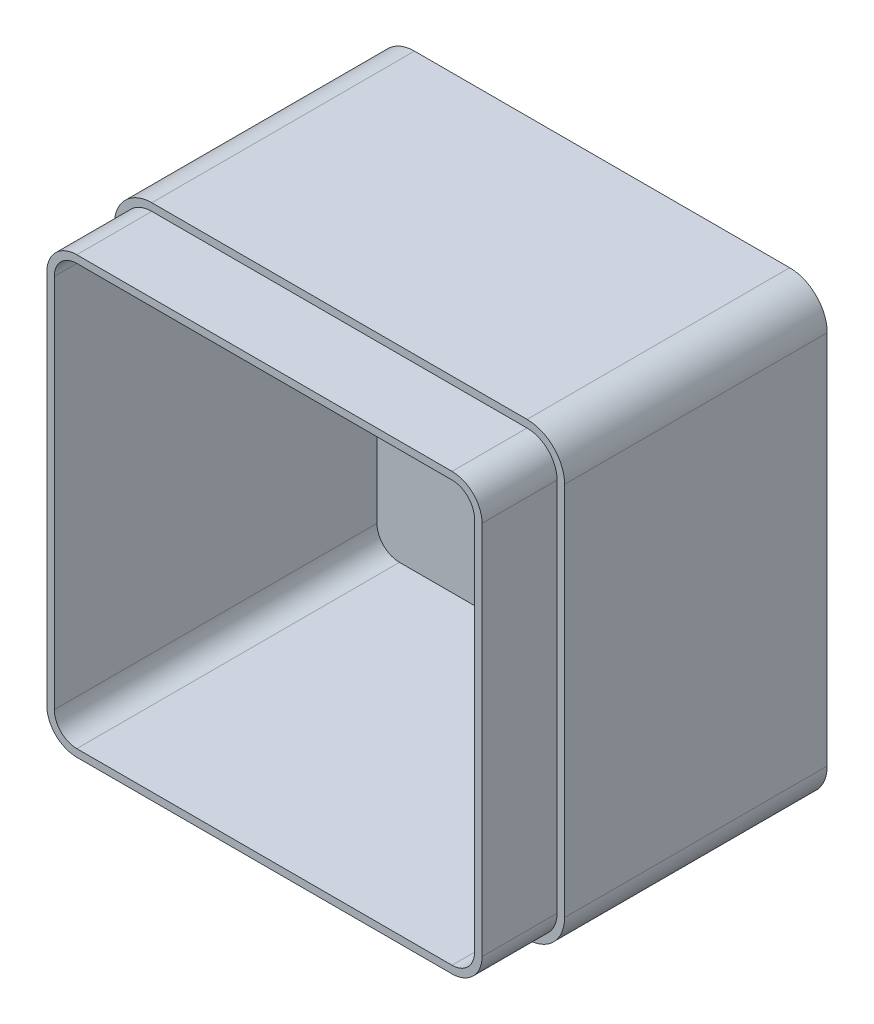
ISO-10303-21;
HEADER;
FILE_DESCRIPTION(('STEP AP214'),'2;1');
FILE_NAME('part.step','',(''),(''),'','','');
FILE_SCHEMA(('AUTOMOTIVE_DESIGN { 1 0 10303 214 1 1 1 1 }'));
ENDSEC;
DATA;
#1=APPLICATION_CONTEXT('core data for automotive mechanical design processes');
#2=APPLICATION_PROTOCOL_DEFINITION('international standard','automotive_design',2000,#1);
#3=PRODUCT_CONTEXT('',#1,'mechanical');
#4=PRODUCT('Part','Part','',(#3));
#5=PRODUCT_RELATED_PRODUCT_CATEGORY('part','',(#4));
#6=PRODUCT_DEFINITION_FORMATION('','',#4);
#7=PRODUCT_DEFINITION_CONTEXT('part definition',#1,'design');
#8=PRODUCT_DEFINITION('design','',#6,#7);
#9=PRODUCT_DEFINITION_SHAPE('','',#8);
#10=(LENGTH_UNIT() NAMED_UNIT(*) SI_UNIT(.MILLI.,.METRE.));
#11=(NAMED_UNIT(*) PLANE_ANGLE_UNIT() SI_UNIT($,.RADIAN.));
#12=(NAMED_UNIT(*) SI_UNIT($,.STERADIAN.) SOLID_ANGLE_UNIT());
#13=UNCERTAINTY_MEASURE_WITH_UNIT(LENGTH_MEASURE(1.E-05),#10,'distance_accuracy_value','');
#14=(GEOMETRIC_REPRESENTATION_CONTEXT(3) GLOBAL_UNCERTAINTY_ASSIGNED_CONTEXT((#13)) GLOBAL_UNIT_ASSIGNED_CONTEXT((#10,
#11,#12)) REPRESENTATION_CONTEXT('',''));
#15=CARTESIAN_POINT('',(0.,0.,0.));
#16=DIRECTION('',(0.,0.,1.));
#17=DIRECTION('',(1.,0.,0.));
#18=AXIS2_PLACEMENT_3D('',#15,#16,#17);
#19=CARTESIAN_POINT('',(0.,0.,90.));
#20=DIRECTION('',(0.,0.,-1.));
#21=DIRECTION('',(-1.,0.,0.));
#22=AXIS2_PLACEMENT_3D('',#19,#20,#21);
#23=PLANE('',#22);
#24=DIRECTION('',(0.,-1.,0.));
#25=VECTOR('',#24,1.);
#26=CARTESIAN_POINT('',(4.,0.,90.));
#27=LINE('',#26,#25);
#28=CARTESIAN_POINT('',(4.,110.,90.));
#29=VERTEX_POINT('',#28);
#30=CARTESIAN_POINT('',(4.,9.99999999999999,90.));
#31=VERTEX_POINT('',#30);
#32=EDGE_CURVE('E349',#29,#31,#27,.T.);
#33=ORIENTED_EDGE('',*,*,#32,.F.);
#34=CARTESIAN_POINT('',(10.,110.,90.));
#35=DIRECTION('',(0.,0.,-1.));
#36=DIRECTION('',(-1.,0.,0.));
#37=AXIS2_PLACEMENT_3D('',#34,#35,#36);
#38=CIRCLE('',#37,6.);
#39=CARTESIAN_POINT('',(9.99999999999999,116.,90.));
#40=VERTEX_POINT('',#39);
#41=EDGE_CURVE('E395',#40,#29,#38,.F.);
#42=ORIENTED_EDGE('',*,*,#41,.F.);
#43=DIRECTION('',(-1.,0.,0.));
#44=VECTOR('',#43,1.);
#45=CARTESIAN_POINT('',(0.,116.,90.));
#46=LINE('',#45,#44);
#47=CARTESIAN_POINT('',(110.,116.,90.));
#48=VERTEX_POINT('',#47);
#49=EDGE_CURVE('E364',#48,#40,#46,.T.);
#50=ORIENTED_EDGE('',*,*,#49,.F.);
#51=CARTESIAN_POINT('',(110.,110.,90.));
#52=DIRECTION('',(0.,0.,-1.));
#53=DIRECTION('',(-1.,0.,0.));
#54=AXIS2_PLACEMENT_3D('',#51,#52,#53);
#55=CIRCLE('',#54,6.);
#56=CARTESIAN_POINT('',(116.,110.,90.));
#57=VERTEX_POINT('',#56);
#58=EDGE_CURVE('E328',#57,#48,#55,.F.);
#59=ORIENTED_EDGE('',*,*,#58,.F.);
#60=DIRECTION('',(0.,1.,0.));
#61=VECTOR('',#60,1.);
#62=CARTESIAN_POINT('',(116.,0.,90.));
#63=LINE('',#62,#61);
#64=CARTESIAN_POINT('',(116.,9.99999999999999,90.));
#65=VERTEX_POINT('',#64);
#66=EDGE_CURVE('E392',#65,#57,#63,.T.);
#67=ORIENTED_EDGE('',*,*,#66,.F.);
#68=CARTESIAN_POINT('',(110.,10.,90.));
#69=DIRECTION('',(0.,0.,-1.));
#70=DIRECTION('',(-1.,0.,0.));
#71=AXIS2_PLACEMENT_3D('',#68,#69,#70);
#72=CIRCLE('',#71,6.);
#73=CARTESIAN_POINT('',(110.,4.,90.));
#74=VERTEX_POINT('',#73);
#75=EDGE_CURVE('E388',#74,#65,#72,.F.);
#76=ORIENTED_EDGE('',*,*,#75,.F.);
#77=DIRECTION('',(1.,0.,0.));
#78=VECTOR('',#77,1.);
#79=CARTESIAN_POINT('',(0.,4.,90.));
#80=LINE('',#79,#78);
#81=CARTESIAN_POINT('',(9.99999999999999,4.,90.));
#82=VERTEX_POINT('',#81);
#83=EDGE_CURVE('E385',#82,#74,#80,.T.);
#84=ORIENTED_EDGE('',*,*,#83,.F.);
#85=CARTESIAN_POINT('',(10.,10.,90.));
#86=DIRECTION('',(0.,0.,-1.));
#87=DIRECTION('',(-1.,0.,0.));
#88=AXIS2_PLACEMENT_3D('',#85,#86,#87);
#89=CIRCLE('',#88,6.);
#90=EDGE_CURVE('E373',#31,#82,#89,.F.);
#91=ORIENTED_EDGE('',*,*,#90,.F.);
#92=EDGE_LOOP('',(#33,#42,#50,#59,#67,#76,#84,#91));
#93=FACE_BOUND('',#92,.T.);
#94=CARTESIAN_POINT('',(10.,110.,90.));
#95=DIRECTION('',(0.,0.,1.));
#96=DIRECTION('',(1.,0.,0.));
#97=AXIS2_PLACEMENT_3D('',#94,#95,#96);
#98=CIRCLE('',#97,8.);
#99=CARTESIAN_POINT('',(9.99999999999999,118.,90.));
#100=VERTEX_POINT('',#99);
#101=CARTESIAN_POINT('',(2.,110.,90.));
#102=VERTEX_POINT('',#101);
#103=EDGE_CURVE('E256',#100,#102,#98,.T.);
#104=ORIENTED_EDGE('',*,*,#103,.T.);
#105=DIRECTION('',(0.,-1.,0.));
#106=VECTOR('',#105,1.);
#107=CARTESIAN_POINT('',(2.,110.,90.));
#108=LINE('',#107,#106);
#109=CARTESIAN_POINT('',(2.,9.99999999999999,90.));
#110=VERTEX_POINT('',#109);
#111=EDGE_CURVE('E206',#102,#110,#108,.T.);
#112=ORIENTED_EDGE('',*,*,#111,.T.);
#113=CARTESIAN_POINT('',(10.,10.,90.));
#114=DIRECTION('',(0.,0.,1.));
#115=DIRECTION('',(1.,0.,0.));
#116=AXIS2_PLACEMENT_3D('',#113,#114,#115);
#117=CIRCLE('',#116,8.);
#118=CARTESIAN_POINT('',(9.99999999999999,2.,90.));
#119=VERTEX_POINT('',#118);
#120=EDGE_CURVE('E54',#110,#119,#117,.T.);
#121=ORIENTED_EDGE('',*,*,#120,.T.);
#122=DIRECTION('',(1.,0.,0.));
#123=VECTOR('',#122,1.);
#124=CARTESIAN_POINT('',(9.99999999999999,2.,90.));
#125=LINE('',#124,#123);
#126=CARTESIAN_POINT('',(110.,2.,90.));
#127=VERTEX_POINT('',#126);
#128=EDGE_CURVE('E263',#119,#127,#125,.T.);
#129=ORIENTED_EDGE('',*,*,#128,.T.);
#130=CARTESIAN_POINT('',(110.,10.,90.));
#131=DIRECTION('',(0.,0.,1.));
#132=DIRECTION('',(1.,0.,0.));
#133=AXIS2_PLACEMENT_3D('',#130,#131,#132);
#134=CIRCLE('',#133,7.99999999999999);
#135=CARTESIAN_POINT('',(118.,10.,90.));
#136=VERTEX_POINT('',#135);
#137=EDGE_CURVE('E267',#127,#136,#134,.T.);
#138=ORIENTED_EDGE('',*,*,#137,.T.);
#139=DIRECTION('',(0.,1.,0.));
#140=VECTOR('',#139,1.);
#141=CARTESIAN_POINT('',(118.,9.99999999999999,90.));
#142=LINE('',#141,#140);
#143=CARTESIAN_POINT('',(118.,110.,90.));
#144=VERTEX_POINT('',#143);
#145=EDGE_CURVE('E271',#136,#144,#142,.T.);
#146=ORIENTED_EDGE('',*,*,#145,.T.);
#147=CARTESIAN_POINT('',(110.,110.,90.));
#148=DIRECTION('',(0.,0.,1.));
#149=DIRECTION('',(1.,0.,0.));
#150=AXIS2_PLACEMENT_3D('',#147,#148,#149);
#151=CIRCLE('',#150,7.99999999999999);
#152=CARTESIAN_POINT('',(110.,118.,90.));
#153=VERTEX_POINT('',#152);
#154=EDGE_CURVE('E233',#144,#153,#151,.T.);
#155=ORIENTED_EDGE('',*,*,#154,.T.);
#156=DIRECTION('',(-1.,0.,0.));
#157=VECTOR('',#156,1.);
#158=CARTESIAN_POINT('',(110.,118.,90.));
#159=LINE('',#158,#157);
#160=EDGE_CURVE('E229',#153,#100,#159,.T.);
#161=ORIENTED_EDGE('',*,*,#160,.T.);
#162=EDGE_LOOP('',(#104,#112,#121,#129,#138,#146,#155,#161));
#163=FACE_BOUND('',#162,.T.);
#164=ADVANCED_FACE('F38',(#93,#163),#23,.F.);
#165=CARTESIAN_POINT('',(4.,0.,90.));
#166=DIRECTION('',(1.,0.,0.));
#167=DIRECTION('',(0.,0.,-1.));
#168=AXIS2_PLACEMENT_3D('',#165,#166,#167);
#169=PLANE('',#168);
#170=DIRECTION('',(0.,-1.,0.));
#171=VECTOR('',#170,1.);
#172=CARTESIAN_POINT('',(4.,0.,4.));
#173=LINE('',#172,#171);
#174=CARTESIAN_POINT('',(4.,110.,4.));
#175=VERTEX_POINT('',#174);
#176=CARTESIAN_POINT('',(4.,9.99999999999999,4.));
#177=VERTEX_POINT('',#176);
#178=EDGE_CURVE('E320',#175,#177,#173,.T.);
#179=ORIENTED_EDGE('',*,*,#178,.F.);
#180=DIRECTION('',(0.,0.,-1.));
#181=VECTOR('',#180,1.);
#182=CARTESIAN_POINT('',(4.,110.,90.));
#183=LINE('',#182,#181);
#184=EDGE_CURVE('E329',#29,#175,#183,.T.);
#185=ORIENTED_EDGE('',*,*,#184,.F.);
#186=ORIENTED_EDGE('',*,*,#32,.T.);
#187=DIRECTION('',(0.,0.,-1.));
#188=VECTOR('',#187,1.);
#189=CARTESIAN_POINT('',(4.,9.99999999999999,90.));
#190=LINE('',#189,#188);
#191=EDGE_CURVE('E325',#177,#31,#190,.F.);
#192=ORIENTED_EDGE('',*,*,#191,.F.);
#193=EDGE_LOOP('',(#179,#185,#186,#192));
#194=FACE_BOUND('',#193,.T.);
#195=ADVANCED_FACE('F503',(#194),#169,.T.);
#196=CARTESIAN_POINT('',(0.,4.,90.));
#197=DIRECTION('',(0.,1.,0.));
#198=DIRECTION('',(0.,0.,1.));
#199=AXIS2_PLACEMENT_3D('',#196,#197,#198);
#200=PLANE('',#199);
#201=ORIENTED_EDGE('',*,*,#83,.T.);
#202=DIRECTION('',(0.,0.,1.));
#203=VECTOR('',#202,1.);
#204=CARTESIAN_POINT('',(110.,4.,90.));
#205=LINE('',#204,#203);
#206=CARTESIAN_POINT('',(110.,4.,4.));
#207=VERTEX_POINT('',#206);
#208=EDGE_CURVE('E361',#207,#74,#205,.T.);
#209=ORIENTED_EDGE('',*,*,#208,.F.);
#210=DIRECTION('',(1.,0.,0.));
#211=VECTOR('',#210,1.);
#212=CARTESIAN_POINT('',(0.,4.,4.));
#213=LINE('',#212,#211);
#214=CARTESIAN_POINT('',(9.99999999999999,4.,4.));
#215=VERTEX_POINT('',#214);
#216=EDGE_CURVE('E324',#215,#207,#213,.T.);
#217=ORIENTED_EDGE('',*,*,#216,.F.);
#218=DIRECTION('',(0.,0.,1.));
#219=VECTOR('',#218,1.);
#220=CARTESIAN_POINT('',(9.99999999999999,4.,90.));
#221=LINE('',#220,#219);
#222=EDGE_CURVE('E352',#82,#215,#221,.F.);
#223=ORIENTED_EDGE('',*,*,#222,.F.);
#224=EDGE_LOOP('',(#201,#209,#217,#223));
#225=FACE_BOUND('',#224,.T.);
#226=ADVANCED_FACE('F511',(#225),#200,.T.);
#227=CARTESIAN_POINT('',(116.,0.,90.));
#228=DIRECTION('',(-1.,0.,0.));
#229=DIRECTION('',(0.,0.,1.));
#230=AXIS2_PLACEMENT_3D('',#227,#228,#229);
#231=PLANE('',#230);
#232=ORIENTED_EDGE('',*,*,#66,.T.);
#233=DIRECTION('',(0.,0.,1.));
#234=VECTOR('',#233,1.);
#235=CARTESIAN_POINT('',(116.,110.,90.));
#236=LINE('',#235,#234);
#237=CARTESIAN_POINT('',(116.,110.,4.));
#238=VERTEX_POINT('',#237);
#239=EDGE_CURVE('E370',#238,#57,#236,.T.);
#240=ORIENTED_EDGE('',*,*,#239,.F.);
#241=DIRECTION('',(0.,1.,0.));
#242=VECTOR('',#241,1.);
#243=CARTESIAN_POINT('',(116.,0.,4.));
#244=LINE('',#243,#242);
#245=CARTESIAN_POINT('',(116.,9.99999999999999,4.));
#246=VERTEX_POINT('',#245);
#247=EDGE_CURVE('E337',#246,#238,#244,.T.);
#248=ORIENTED_EDGE('',*,*,#247,.F.);
#249=DIRECTION('',(0.,0.,1.));
#250=VECTOR('',#249,1.);
#251=CARTESIAN_POINT('',(116.,9.99999999999999,90.));
#252=LINE('',#251,#250);
#253=EDGE_CURVE('E365',#65,#246,#252,.F.);
#254=ORIENTED_EDGE('',*,*,#253,.F.);
#255=EDGE_LOOP('',(#232,#240,#248,#254));
#256=FACE_BOUND('',#255,.T.);
#257=ADVANCED_FACE('F631',(#256),#231,.T.);
#258=CARTESIAN_POINT('',(0.,116.,90.));
#259=DIRECTION('',(0.,-1.,0.));
#260=DIRECTION('',(0.,0.,-1.));
#261=AXIS2_PLACEMENT_3D('',#258,#259,#260);
#262=PLANE('',#261);
#263=DIRECTION('',(-1.,0.,0.));
#264=VECTOR('',#263,1.);
#265=CARTESIAN_POINT('',(0.,116.,4.));
#266=LINE('',#265,#264);
#267=CARTESIAN_POINT('',(110.,116.,4.));
#268=VERTEX_POINT('',#267);
#269=CARTESIAN_POINT('',(9.99999999999999,116.,4.));
#270=VERTEX_POINT('',#269);
#271=EDGE_CURVE('E345',#268,#270,#266,.T.);
#272=ORIENTED_EDGE('',*,*,#271,.F.);
#273=DIRECTION('',(0.,0.,-1.));
#274=VECTOR('',#273,1.);
#275=CARTESIAN_POINT('',(110.,116.,90.));
#276=LINE('',#275,#274);
#277=EDGE_CURVE('E369',#48,#268,#276,.T.);
#278=ORIENTED_EDGE('',*,*,#277,.F.);
#279=ORIENTED_EDGE('',*,*,#49,.T.);
#280=DIRECTION('',(0.,0.,-1.));
#281=VECTOR('',#280,1.);
#282=CARTESIAN_POINT('',(9.99999999999999,116.,90.));
#283=LINE('',#282,#281);
#284=EDGE_CURVE('E377',#270,#40,#283,.F.);
#285=ORIENTED_EDGE('',*,*,#284,.F.);
#286=EDGE_LOOP('',(#272,#278,#279,#285));
#287=FACE_BOUND('',#286,.T.);
#288=ADVANCED_FACE('F635',(#287),#262,.T.);
#289=CARTESIAN_POINT('',(0.,0.,4.));
#290=DIRECTION('',(0.,0.,-1.));
#291=DIRECTION('',(-1.,0.,0.));
#292=AXIS2_PLACEMENT_3D('',#289,#290,#291);
#293=PLANE('',#292);
#294=ORIENTED_EDGE('',*,*,#216,.T.);
#295=CARTESIAN_POINT('',(110.,10.,4.));
#296=DIRECTION('',(0.,0.,-1.));
#297=DIRECTION('',(-1.,0.,0.));
#298=AXIS2_PLACEMENT_3D('',#295,#296,#297);
#299=CIRCLE('',#298,6.);
#300=EDGE_CURVE('E340',#246,#207,#299,.T.);
#301=ORIENTED_EDGE('',*,*,#300,.F.);
#302=ORIENTED_EDGE('',*,*,#247,.T.);
#303=CARTESIAN_POINT('',(110.,110.,4.));
#304=DIRECTION('',(0.,0.,-1.));
#305=DIRECTION('',(-1.,0.,0.));
#306=AXIS2_PLACEMENT_3D('',#303,#304,#305);
#307=CIRCLE('',#306,6.);
#308=EDGE_CURVE('E344',#268,#238,#307,.T.);
#309=ORIENTED_EDGE('',*,*,#308,.F.);
#310=ORIENTED_EDGE('',*,*,#271,.T.);
#311=CARTESIAN_POINT('',(10.,110.,4.));
#312=DIRECTION('',(0.,0.,-1.));
#313=DIRECTION('',(-1.,0.,0.));
#314=AXIS2_PLACEMENT_3D('',#311,#312,#313);
#315=CIRCLE('',#314,6.);
#316=EDGE_CURVE('E341',#175,#270,#315,.T.);
#317=ORIENTED_EDGE('',*,*,#316,.F.);
#318=ORIENTED_EDGE('',*,*,#178,.T.);
#319=CARTESIAN_POINT('',(10.,10.,4.));
#320=DIRECTION('',(0.,0.,-1.));
#321=DIRECTION('',(-1.,0.,0.));
#322=AXIS2_PLACEMENT_3D('',#319,#320,#321);
#323=CIRCLE('',#322,6.);
#324=EDGE_CURVE('E333',#215,#177,#323,.T.);
#325=ORIENTED_EDGE('',*,*,#324,.F.);
#326=EDGE_LOOP('',(#294,#301,#302,#309,#310,#317,#318,#325));
#327=FACE_BOUND('',#326,.T.);
#328=ADVANCED_FACE('F639',(#327),#293,.F.);
#329=CARTESIAN_POINT('',(10.,10.,90.));
#330=DIRECTION('',(0.,0.,-1.));
#331=DIRECTION('',(-1.,0.,0.));
#332=AXIS2_PLACEMENT_3D('',#329,#330,#331);
#333=CYLINDRICAL_SURFACE('',#332,6.);
#334=ORIENTED_EDGE('',*,*,#90,.T.);
#335=ORIENTED_EDGE('',*,*,#222,.T.);
#336=ORIENTED_EDGE('',*,*,#324,.T.);
#337=ORIENTED_EDGE('',*,*,#191,.T.);
#338=EDGE_LOOP('',(#334,#335,#336,#337));
#339=FACE_BOUND('',#338,.T.);
#340=ADVANCED_FACE('F643',(#339),#333,.F.);
#341=CARTESIAN_POINT('',(110.,10.,90.));
#342=DIRECTION('',(0.,0.,-1.));
#343=DIRECTION('',(-1.,0.,0.));
#344=AXIS2_PLACEMENT_3D('',#341,#342,#343);
#345=CYLINDRICAL_SURFACE('',#344,6.);
#346=ORIENTED_EDGE('',*,*,#75,.T.);
#347=ORIENTED_EDGE('',*,*,#253,.T.);
#348=ORIENTED_EDGE('',*,*,#300,.T.);
#349=ORIENTED_EDGE('',*,*,#208,.T.);
#350=EDGE_LOOP('',(#346,#347,#348,#349));
#351=FACE_BOUND('',#350,.T.);
#352=ADVANCED_FACE('F647',(#351),#345,.F.);
#353=CARTESIAN_POINT('',(10.,110.,90.));
#354=DIRECTION('',(0.,0.,-1.));
#355=DIRECTION('',(-1.,0.,0.));
#356=AXIS2_PLACEMENT_3D('',#353,#354,#355);
#357=CYLINDRICAL_SURFACE('',#356,6.);
#358=ORIENTED_EDGE('',*,*,#41,.T.);
#359=ORIENTED_EDGE('',*,*,#184,.T.);
#360=ORIENTED_EDGE('',*,*,#316,.T.);
#361=ORIENTED_EDGE('',*,*,#284,.T.);
#362=EDGE_LOOP('',(#358,#359,#360,#361));
#363=FACE_BOUND('',#362,.T.);
#364=ADVANCED_FACE('F650',(#363),#357,.F.);
#365=CARTESIAN_POINT('',(110.,110.,90.));
#366=DIRECTION('',(0.,0.,-1.));
#367=DIRECTION('',(-1.,0.,0.));
#368=AXIS2_PLACEMENT_3D('',#365,#366,#367);
#369=CYLINDRICAL_SURFACE('',#368,6.);
#370=ORIENTED_EDGE('',*,*,#58,.T.);
#371=ORIENTED_EDGE('',*,*,#277,.T.);
#372=ORIENTED_EDGE('',*,*,#308,.T.);
#373=ORIENTED_EDGE('',*,*,#239,.T.);
#374=EDGE_LOOP('',(#370,#371,#372,#373));
#375=FACE_BOUND('',#374,.T.);
#376=ADVANCED_FACE('F518',(#375),#369,.F.);
#377=CARTESIAN_POINT('',(10.,110.,70.));
#378=DIRECTION('',(0.,0.,1.));
#379=DIRECTION('',(1.,0.,0.));
#380=AXIS2_PLACEMENT_3D('',#377,#378,#379);
#381=PLANE('',#380);
#382=DIRECTION('',(-1.,0.,0.));
#383=VECTOR('',#382,1.);
#384=CARTESIAN_POINT('',(110.,118.,70.));
#385=LINE('',#384,#383);
#386=CARTESIAN_POINT('',(110.,118.,70.));
#387=VERTEX_POINT('',#386);
#388=CARTESIAN_POINT('',(9.99999999999999,118.,70.));
#389=VERTEX_POINT('',#388);
#390=EDGE_CURVE('E213',#387,#389,#385,.T.);
#391=ORIENTED_EDGE('',*,*,#390,.F.);
#392=CARTESIAN_POINT('',(110.,110.,70.));
#393=DIRECTION('',(0.,0.,1.));
#394=DIRECTION('',(1.,0.,0.));
#395=AXIS2_PLACEMENT_3D('',#392,#393,#394);
#396=CIRCLE('',#395,7.99999999999999);
#397=CARTESIAN_POINT('',(118.,110.,70.));
#398=VERTEX_POINT('',#397);
#399=EDGE_CURVE('E250',#398,#387,#396,.T.);
#400=ORIENTED_EDGE('',*,*,#399,.F.);
#401=DIRECTION('',(0.,1.,0.));
#402=VECTOR('',#401,1.);
#403=CARTESIAN_POINT('',(118.,9.99999999999999,70.));
#404=LINE('',#403,#402);
#405=CARTESIAN_POINT('',(118.,10.,70.));
#406=VERTEX_POINT('',#405);
#407=EDGE_CURVE('E246',#406,#398,#404,.T.);
#408=ORIENTED_EDGE('',*,*,#407,.F.);
#409=CARTESIAN_POINT('',(110.,10.,70.));
#410=DIRECTION('',(0.,0.,1.));
#411=DIRECTION('',(1.,0.,0.));
#412=AXIS2_PLACEMENT_3D('',#409,#410,#411);
#413=CIRCLE('',#412,7.99999999999999);
#414=CARTESIAN_POINT('',(110.,2.,70.));
#415=VERTEX_POINT('',#414);
#416=EDGE_CURVE('E242',#415,#406,#413,.T.);
#417=ORIENTED_EDGE('',*,*,#416,.F.);
#418=DIRECTION('',(1.,0.,0.));
#419=VECTOR('',#418,1.);
#420=CARTESIAN_POINT('',(9.99999999999999,2.,70.));
#421=LINE('',#420,#419);
#422=CARTESIAN_POINT('',(9.99999999999999,2.,70.));
#423=VERTEX_POINT('',#422);
#424=EDGE_CURVE('E238',#423,#415,#421,.T.);
#425=ORIENTED_EDGE('',*,*,#424,.F.);
#426=CARTESIAN_POINT('',(10.,10.,70.));
#427=DIRECTION('',(0.,0.,1.));
#428=DIRECTION('',(1.,0.,0.));
#429=AXIS2_PLACEMENT_3D('',#426,#427,#428);
#430=CIRCLE('',#429,8.);
#431=CARTESIAN_POINT('',(2.,9.99999999999999,70.));
#432=VERTEX_POINT('',#431);
#433=EDGE_CURVE('E223',#432,#423,#430,.T.);
#434=ORIENTED_EDGE('',*,*,#433,.F.);
#435=DIRECTION('',(0.,-1.,0.));
#436=VECTOR('',#435,1.);
#437=CARTESIAN_POINT('',(2.,110.,70.));
#438=LINE('',#437,#436);
#439=CARTESIAN_POINT('',(2.,110.,70.));
#440=VERTEX_POINT('',#439);
#441=EDGE_CURVE('E204',#440,#432,#438,.T.);
#442=ORIENTED_EDGE('',*,*,#441,.F.);
#443=CARTESIAN_POINT('',(10.,110.,70.));
#444=DIRECTION('',(0.,0.,1.));
#445=DIRECTION('',(1.,0.,0.));
#446=AXIS2_PLACEMENT_3D('',#443,#444,#445);
#447=CIRCLE('',#446,8.);
#448=EDGE_CURVE('E219',#389,#440,#447,.T.);
#449=ORIENTED_EDGE('',*,*,#448,.F.);
#450=EDGE_LOOP('',(#391,#400,#408,#417,#425,#434,#442,#449));
#451=FACE_BOUND('',#450,.T.);
#452=CARTESIAN_POINT('',(10.,110.,70.));
#453=DIRECTION('',(0.,0.,1.));
#454=DIRECTION('',(1.,0.,0.));
#455=AXIS2_PLACEMENT_3D('',#452,#453,#454);
#456=CIRCLE('',#455,10.);
#457=CARTESIAN_POINT('',(10.,120.,70.));
#458=VERTEX_POINT('',#457);
#459=CARTESIAN_POINT('',(0.,110.,70.));
#460=VERTEX_POINT('',#459);
#461=EDGE_CURVE('E280',#458,#460,#456,.T.);
#462=ORIENTED_EDGE('',*,*,#461,.T.);
#463=DIRECTION('',(0.,-1.,0.));
#464=VECTOR('',#463,1.);
#465=CARTESIAN_POINT('',(0.,110.,70.));
#466=LINE('',#465,#464);
#467=CARTESIAN_POINT('',(0.,10.,70.));
#468=VERTEX_POINT('',#467);
#469=EDGE_CURVE('E300',#460,#468,#466,.T.);
#470=ORIENTED_EDGE('',*,*,#469,.T.);
#471=CARTESIAN_POINT('',(10.,10.,70.));
#472=DIRECTION('',(0.,0.,1.));
#473=DIRECTION('',(1.,0.,0.));
#474=AXIS2_PLACEMENT_3D('',#471,#472,#473);
#475=CIRCLE('',#474,10.);
#476=CARTESIAN_POINT('',(9.99999999999999,0.,70.));
#477=VERTEX_POINT('',#476);
#478=EDGE_CURVE('E303',#468,#477,#475,.T.);
#479=ORIENTED_EDGE('',*,*,#478,.T.);
#480=DIRECTION('',(1.,0.,0.));
#481=VECTOR('',#480,1.);
#482=CARTESIAN_POINT('',(9.99999999999999,0.,70.));
#483=LINE('',#482,#481);
#484=CARTESIAN_POINT('',(110.,0.,70.));
#485=VERTEX_POINT('',#484);
#486=EDGE_CURVE('E306',#477,#485,#483,.T.);
#487=ORIENTED_EDGE('',*,*,#486,.T.);
#488=CARTESIAN_POINT('',(110.,10.,70.));
#489=DIRECTION('',(0.,0.,1.));
#490=DIRECTION('',(1.,0.,0.));
#491=AXIS2_PLACEMENT_3D('',#488,#489,#490);
#492=CIRCLE('',#491,9.99999999999999);
#493=CARTESIAN_POINT('',(120.,10.,70.));
#494=VERTEX_POINT('',#493);
#495=EDGE_CURVE('E309',#485,#494,#492,.T.);
#496=ORIENTED_EDGE('',*,*,#495,.T.);
#497=DIRECTION('',(0.,1.,0.));
#498=VECTOR('',#497,1.);
#499=CARTESIAN_POINT('',(120.,10.,70.));
#500=LINE('',#499,#498);
#501=CARTESIAN_POINT('',(120.,110.,70.));
#502=VERTEX_POINT('',#501);
#503=EDGE_CURVE('E62',#494,#502,#500,.T.);
#504=ORIENTED_EDGE('',*,*,#503,.T.);
#505=CARTESIAN_POINT('',(110.,110.,70.));
#506=DIRECTION('',(0.,0.,1.));
#507=DIRECTION('',(1.,0.,0.));
#508=AXIS2_PLACEMENT_3D('',#505,#506,#507);
#509=CIRCLE('',#508,9.99999999999999);
#510=CARTESIAN_POINT('',(110.,120.,70.));
#511=VERTEX_POINT('',#510);
#512=EDGE_CURVE('E314',#502,#511,#509,.T.);
#513=ORIENTED_EDGE('',*,*,#512,.T.);
#514=DIRECTION('',(-1.,0.,0.));
#515=VECTOR('',#514,1.);
#516=CARTESIAN_POINT('',(110.,120.,70.));
#517=LINE('',#516,#515);
#518=EDGE_CURVE('E317',#511,#458,#517,.T.);
#519=ORIENTED_EDGE('',*,*,#518,.T.);
#520=EDGE_LOOP('',(#462,#470,#479,#487,#496,#504,#513,#519));
#521=FACE_BOUND('',#520,.T.);
#522=ADVANCED_FACE('F218',(#451,#521),#381,.T.);
#523=CARTESIAN_POINT('',(10.,110.,70.));
#524=DIRECTION('',(0.,0.,1.));
#525=DIRECTION('',(1.,0.,0.));
#526=AXIS2_PLACEMENT_3D('',#523,#524,#525);
#527=CYLINDRICAL_SURFACE('',#526,8.);
#528=ORIENTED_EDGE('',*,*,#103,.F.);
#529=DIRECTION('',(0.,0.,1.));
#530=VECTOR('',#529,1.);
#531=CARTESIAN_POINT('',(9.99999999999999,118.,70.));
#532=LINE('',#531,#530);
#533=EDGE_CURVE('E227',#389,#100,#532,.T.);
#534=ORIENTED_EDGE('',*,*,#533,.F.);
#535=ORIENTED_EDGE('',*,*,#448,.T.);
#536=DIRECTION('',(0.,0.,1.));
#537=VECTOR('',#536,1.);
#538=CARTESIAN_POINT('',(2.,110.,70.));
#539=LINE('',#538,#537);
#540=EDGE_CURVE('E201',#440,#102,#539,.T.);
#541=ORIENTED_EDGE('',*,*,#540,.T.);
#542=EDGE_LOOP('',(#528,#534,#535,#541));
#543=FACE_BOUND('',#542,.T.);
#544=ADVANCED_FACE('F226',(#543),#527,.T.);
#545=CARTESIAN_POINT('',(110.,118.,70.));
#546=DIRECTION('',(0.,1.,0.));
#547=DIRECTION('',(0.,0.,1.));
#548=AXIS2_PLACEMENT_3D('',#545,#546,#547);
#549=PLANE('',#548);
#550=ORIENTED_EDGE('',*,*,#160,.F.);
#551=DIRECTION('',(0.,0.,1.));
#552=VECTOR('',#551,1.);
#553=CARTESIAN_POINT('',(110.,118.,70.));
#554=LINE('',#553,#552);
#555=EDGE_CURVE('E281',#387,#153,#554,.T.);
#556=ORIENTED_EDGE('',*,*,#555,.F.);
#557=ORIENTED_EDGE('',*,*,#390,.T.);
#558=ORIENTED_EDGE('',*,*,#533,.T.);
#559=EDGE_LOOP('',(#550,#556,#557,#558));
#560=FACE_BOUND('',#559,.T.);
#561=ADVANCED_FACE('F559',(#560),#549,.T.);
#562=CARTESIAN_POINT('',(110.,110.,70.));
#563=DIRECTION('',(0.,0.,1.));
#564=DIRECTION('',(1.,0.,0.));
#565=AXIS2_PLACEMENT_3D('',#562,#563,#564);
#566=CYLINDRICAL_SURFACE('',#565,7.99999999999999);
#567=ORIENTED_EDGE('',*,*,#154,.F.);
#568=DIRECTION('',(0.,0.,1.));
#569=VECTOR('',#568,1.);
#570=CARTESIAN_POINT('',(118.,110.,70.));
#571=LINE('',#570,#569);
#572=EDGE_CURVE('E284',#398,#144,#571,.T.);
#573=ORIENTED_EDGE('',*,*,#572,.F.);
#574=ORIENTED_EDGE('',*,*,#399,.T.);
#575=ORIENTED_EDGE('',*,*,#555,.T.);
#576=EDGE_LOOP('',(#567,#573,#574,#575));
#577=FACE_BOUND('',#576,.T.);
#578=ADVANCED_FACE('F567',(#577),#566,.T.);
#579=CARTESIAN_POINT('',(118.,9.99999999999999,70.));
#580=DIRECTION('',(1.,0.,0.));
#581=DIRECTION('',(0.,0.,-1.));
#582=AXIS2_PLACEMENT_3D('',#579,#580,#581);
#583=PLANE('',#582);
#584=ORIENTED_EDGE('',*,*,#145,.F.);
#585=DIRECTION('',(0.,0.,1.));
#586=VECTOR('',#585,1.);
#587=CARTESIAN_POINT('',(118.,10.,70.));
#588=LINE('',#587,#586);
#589=EDGE_CURVE('E287',#406,#136,#588,.T.);
#590=ORIENTED_EDGE('',*,*,#589,.F.);
#591=ORIENTED_EDGE('',*,*,#407,.T.);
#592=ORIENTED_EDGE('',*,*,#572,.T.);
#593=EDGE_LOOP('',(#584,#590,#591,#592));
#594=FACE_BOUND('',#593,.T.);
#595=ADVANCED_FACE('F576',(#594),#583,.T.);
#596=CARTESIAN_POINT('',(110.,10.,70.));
#597=DIRECTION('',(0.,0.,1.));
#598=DIRECTION('',(1.,0.,0.));
#599=AXIS2_PLACEMENT_3D('',#596,#597,#598);
#600=CYLINDRICAL_SURFACE('',#599,7.99999999999999);
#601=ORIENTED_EDGE('',*,*,#137,.F.);
#602=DIRECTION('',(0.,0.,1.));
#603=VECTOR('',#602,1.);
#604=CARTESIAN_POINT('',(110.,2.,70.));
#605=LINE('',#604,#603);
#606=EDGE_CURVE('E290',#415,#127,#605,.T.);
#607=ORIENTED_EDGE('',*,*,#606,.F.);
#608=ORIENTED_EDGE('',*,*,#416,.T.);
#609=ORIENTED_EDGE('',*,*,#589,.T.);
#610=EDGE_LOOP('',(#601,#607,#608,#609));
#611=FACE_BOUND('',#610,.T.);
#612=ADVANCED_FACE('F585',(#611),#600,.T.);
#613=CARTESIAN_POINT('',(9.99999999999999,2.,70.));
#614=DIRECTION('',(0.,-1.,0.));
#615=DIRECTION('',(0.,0.,-1.));
#616=AXIS2_PLACEMENT_3D('',#613,#614,#615);
#617=PLANE('',#616);
#618=ORIENTED_EDGE('',*,*,#128,.F.);
#619=DIRECTION('',(0.,0.,1.));
#620=VECTOR('',#619,1.);
#621=CARTESIAN_POINT('',(9.99999999999999,2.,70.));
#622=LINE('',#621,#620);
#623=EDGE_CURVE('E293',#423,#119,#622,.T.);
#624=ORIENTED_EDGE('',*,*,#623,.F.);
#625=ORIENTED_EDGE('',*,*,#424,.T.);
#626=ORIENTED_EDGE('',*,*,#606,.T.);
#627=EDGE_LOOP('',(#618,#624,#625,#626));
#628=FACE_BOUND('',#627,.T.);
#629=ADVANCED_FACE('F594',(#628),#617,.T.);
#630=CARTESIAN_POINT('',(10.,10.,70.));
#631=DIRECTION('',(0.,0.,1.));
#632=DIRECTION('',(1.,0.,0.));
#633=AXIS2_PLACEMENT_3D('',#630,#631,#632);
#634=CYLINDRICAL_SURFACE('',#633,8.);
#635=ORIENTED_EDGE('',*,*,#120,.F.);
#636=DIRECTION('',(0.,0.,1.));
#637=VECTOR('',#636,1.);
#638=CARTESIAN_POINT('',(2.,9.99999999999999,70.));
#639=LINE('',#638,#637);
#640=EDGE_CURVE('E212',#432,#110,#639,.T.);
#641=ORIENTED_EDGE('',*,*,#640,.F.);
#642=ORIENTED_EDGE('',*,*,#433,.T.);
#643=ORIENTED_EDGE('',*,*,#623,.T.);
#644=EDGE_LOOP('',(#635,#641,#642,#643));
#645=FACE_BOUND('',#644,.T.);
#646=ADVANCED_FACE('F603',(#645),#634,.T.);
#647=CARTESIAN_POINT('',(2.,110.,70.));
#648=DIRECTION('',(-1.,0.,0.));
#649=DIRECTION('',(0.,0.,1.));
#650=AXIS2_PLACEMENT_3D('',#647,#648,#649);
#651=PLANE('',#650);
#652=ORIENTED_EDGE('',*,*,#111,.F.);
#653=ORIENTED_EDGE('',*,*,#540,.F.);
#654=ORIENTED_EDGE('',*,*,#441,.T.);
#655=ORIENTED_EDGE('',*,*,#640,.T.);
#656=EDGE_LOOP('',(#652,#653,#654,#655));
#657=FACE_BOUND('',#656,.T.);
#658=ADVANCED_FACE('F203',(#657),#651,.T.);
#659=CARTESIAN_POINT('',(0.,0.,0.));
#660=DIRECTION('',(0.,0.,-1.));
#661=DIRECTION('',(-1.,0.,0.));
#662=AXIS2_PLACEMENT_3D('',#659,#660,#661);
#663=PLANE('',#662);
#664=DIRECTION('',(1.,0.,0.));
#665=VECTOR('',#664,1.);
#666=CARTESIAN_POINT('',(0.,0.,0.));
#667=LINE('',#666,#665);
#668=CARTESIAN_POINT('',(10.,0.,0.));
#669=VERTEX_POINT('',#668);
#670=CARTESIAN_POINT('',(110.,0.,0.));
#671=VERTEX_POINT('',#670);
#672=EDGE_CURVE('E408',#669,#671,#667,.T.);
#673=ORIENTED_EDGE('',*,*,#672,.F.);
#674=CARTESIAN_POINT('',(10.,10.,0.));
#675=DIRECTION('',(0.,0.,-1.));
#676=DIRECTION('',(-1.,0.,0.));
#677=AXIS2_PLACEMENT_3D('',#674,#675,#676);
#678=CIRCLE('',#677,10.);
#679=CARTESIAN_POINT('',(0.,10.,0.));
#680=VERTEX_POINT('',#679);
#681=EDGE_CURVE('E436',#669,#680,#678,.T.);
#682=ORIENTED_EDGE('',*,*,#681,.T.);
#683=DIRECTION('',(0.,-1.,0.));
#684=VECTOR('',#683,1.);
#685=CARTESIAN_POINT('',(0.,0.,0.));
#686=LINE('',#685,#684);
#687=CARTESIAN_POINT('',(0.,110.,0.));
#688=VERTEX_POINT('',#687);
#689=EDGE_CURVE('E381',#688,#680,#686,.T.);
#690=ORIENTED_EDGE('',*,*,#689,.F.);
#691=CARTESIAN_POINT('',(10.,110.,0.));
#692=DIRECTION('',(0.,0.,-1.));
#693=DIRECTION('',(-1.,0.,0.));
#694=AXIS2_PLACEMENT_3D('',#691,#692,#693);
#695=CIRCLE('',#694,10.);
#696=CARTESIAN_POINT('',(10.,120.,0.));
#697=VERTEX_POINT('',#696);
#698=EDGE_CURVE('E430',#688,#697,#695,.T.);
#699=ORIENTED_EDGE('',*,*,#698,.T.);
#700=DIRECTION('',(-1.,0.,0.));
#701=VECTOR('',#700,1.);
#702=CARTESIAN_POINT('',(0.,120.,0.));
#703=LINE('',#702,#701);
#704=CARTESIAN_POINT('',(110.,120.,0.));
#705=VERTEX_POINT('',#704);
#706=EDGE_CURVE('E416',#705,#697,#703,.T.);
#707=ORIENTED_EDGE('',*,*,#706,.F.);
#708=CARTESIAN_POINT('',(110.,110.,0.));
#709=DIRECTION('',(0.,0.,-1.));
#710=DIRECTION('',(-1.,0.,0.));
#711=AXIS2_PLACEMENT_3D('',#708,#709,#710);
#712=CIRCLE('',#711,10.);
#713=CARTESIAN_POINT('',(120.,110.,0.));
#714=VERTEX_POINT('',#713);
#715=EDGE_CURVE('E427',#705,#714,#712,.T.);
#716=ORIENTED_EDGE('',*,*,#715,.T.);
#717=DIRECTION('',(0.,1.,0.));
#718=VECTOR('',#717,1.);
#719=CARTESIAN_POINT('',(120.,0.,0.));
#720=LINE('',#719,#718);
#721=CARTESIAN_POINT('',(120.,10.,0.));
#722=VERTEX_POINT('',#721);
#723=EDGE_CURVE('E412',#722,#714,#720,.T.);
#724=ORIENTED_EDGE('',*,*,#723,.F.);
#725=CARTESIAN_POINT('',(110.,10.,0.));
#726=DIRECTION('',(0.,0.,-1.));
#727=DIRECTION('',(-1.,0.,0.));
#728=AXIS2_PLACEMENT_3D('',#725,#726,#727);
#729=CIRCLE('',#728,10.);
#730=EDGE_CURVE('E433',#722,#671,#729,.T.);
#731=ORIENTED_EDGE('',*,*,#730,.T.);
#732=EDGE_LOOP('',(#673,#682,#690,#699,#707,#716,#724,#731));
#733=FACE_BOUND('',#732,.T.);
#734=ADVANCED_FACE('F465',(#733),#663,.T.);
#735=CARTESIAN_POINT('',(10.,110.,90.));
#736=DIRECTION('',(0.,0.,-1.));
#737=DIRECTION('',(-1.,0.,0.));
#738=AXIS2_PLACEMENT_3D('',#735,#736,#737);
#739=CYLINDRICAL_SURFACE('',#738,10.);
#740=DIRECTION('',(0.,0.,-1.));
#741=VECTOR('',#740,1.);
#742=CARTESIAN_POINT('',(0.,110.,90.));
#743=LINE('',#742,#741);
#744=EDGE_CURVE('E439',#460,#688,#743,.T.);
#745=ORIENTED_EDGE('',*,*,#744,.F.);
#746=ORIENTED_EDGE('',*,*,#461,.F.);
#747=DIRECTION('',(0.,0.,-1.));
#748=VECTOR('',#747,1.);
#749=CARTESIAN_POINT('',(10.,120.,90.));
#750=LINE('',#749,#748);
#751=EDGE_CURVE('E11',#697,#458,#750,.F.);
#752=ORIENTED_EDGE('',*,*,#751,.F.);
#753=ORIENTED_EDGE('',*,*,#698,.F.);
#754=EDGE_LOOP('',(#745,#746,#752,#753));
#755=FACE_BOUND('',#754,.T.);
#756=ADVANCED_FACE('F470',(#755),#739,.T.);
#757=CARTESIAN_POINT('',(110.,110.,90.));
#758=DIRECTION('',(0.,0.,-1.));
#759=DIRECTION('',(-1.,0.,0.));
#760=AXIS2_PLACEMENT_3D('',#757,#758,#759);
#761=CYLINDRICAL_SURFACE('',#760,10.);
#762=DIRECTION('',(0.,0.,-1.));
#763=VECTOR('',#762,1.);
#764=CARTESIAN_POINT('',(110.,120.,90.));
#765=LINE('',#764,#763);
#766=EDGE_CURVE('E47',#511,#705,#765,.T.);
#767=ORIENTED_EDGE('',*,*,#766,.F.);
#768=ORIENTED_EDGE('',*,*,#512,.F.);
#769=DIRECTION('',(0.,0.,-1.));
#770=VECTOR('',#769,1.);
#771=CARTESIAN_POINT('',(120.,110.,90.));
#772=LINE('',#771,#770);
#773=EDGE_CURVE('E446',#714,#502,#772,.F.);
#774=ORIENTED_EDGE('',*,*,#773,.F.);
#775=ORIENTED_EDGE('',*,*,#715,.F.);
#776=EDGE_LOOP('',(#767,#768,#774,#775));
#777=FACE_BOUND('',#776,.T.);
#778=ADVANCED_FACE('F40',(#777),#761,.T.);
#779=CARTESIAN_POINT('',(0.,120.,90.));
#780=DIRECTION('',(0.,-1.,0.));
#781=DIRECTION('',(0.,0.,-1.));
#782=AXIS2_PLACEMENT_3D('',#779,#780,#781);
#783=PLANE('',#782);
#784=ORIENTED_EDGE('',*,*,#518,.F.);
#785=ORIENTED_EDGE('',*,*,#766,.T.);
#786=ORIENTED_EDGE('',*,*,#706,.T.);
#787=ORIENTED_EDGE('',*,*,#751,.T.);
#788=EDGE_LOOP('',(#784,#785,#786,#787));
#789=FACE_BOUND('',#788,.T.);
#790=ADVANCED_FACE('F457',(#789),#783,.F.);
#791=CARTESIAN_POINT('',(110.,10.,90.));
#792=DIRECTION('',(0.,0.,-1.));
#793=DIRECTION('',(-1.,0.,0.));
#794=AXIS2_PLACEMENT_3D('',#791,#792,#793);
#795=CYLINDRICAL_SURFACE('',#794,10.);
#796=DIRECTION('',(0.,0.,-1.));
#797=VECTOR('',#796,1.);
#798=CARTESIAN_POINT('',(120.,10.,90.));
#799=LINE('',#798,#797);
#800=EDGE_CURVE('E450',#494,#722,#799,.T.);
#801=ORIENTED_EDGE('',*,*,#800,.F.);
#802=ORIENTED_EDGE('',*,*,#495,.F.);
#803=DIRECTION('',(0.,0.,-1.));
#804=VECTOR('',#803,1.);
#805=CARTESIAN_POINT('',(110.,0.,90.));
#806=LINE('',#805,#804);
#807=EDGE_CURVE('E420',#671,#485,#806,.F.);
#808=ORIENTED_EDGE('',*,*,#807,.F.);
#809=ORIENTED_EDGE('',*,*,#730,.F.);
#810=EDGE_LOOP('',(#801,#802,#808,#809));
#811=FACE_BOUND('',#810,.T.);
#812=ADVANCED_FACE('F489',(#811),#795,.T.);
#813=CARTESIAN_POINT('',(120.,0.,90.));
#814=DIRECTION('',(-1.,0.,0.));
#815=DIRECTION('',(0.,0.,1.));
#816=AXIS2_PLACEMENT_3D('',#813,#814,#815);
#817=PLANE('',#816);
#818=ORIENTED_EDGE('',*,*,#503,.F.);
#819=ORIENTED_EDGE('',*,*,#800,.T.);
#820=ORIENTED_EDGE('',*,*,#723,.T.);
#821=ORIENTED_EDGE('',*,*,#773,.T.);
#822=EDGE_LOOP('',(#818,#819,#820,#821));
#823=FACE_BOUND('',#822,.T.);
#824=ADVANCED_FACE('F491',(#823),#817,.F.);
#825=CARTESIAN_POINT('',(10.,10.,90.));
#826=DIRECTION('',(0.,0.,-1.));
#827=DIRECTION('',(-1.,0.,0.));
#828=AXIS2_PLACEMENT_3D('',#825,#826,#827);
#829=CYLINDRICAL_SURFACE('',#828,10.);
#830=DIRECTION('',(0.,0.,-1.));
#831=VECTOR('',#830,1.);
#832=CARTESIAN_POINT('',(10.,0.,90.));
#833=LINE('',#832,#831);
#834=EDGE_CURVE('E424',#477,#669,#833,.T.);
#835=ORIENTED_EDGE('',*,*,#834,.F.);
#836=ORIENTED_EDGE('',*,*,#478,.F.);
#837=DIRECTION('',(0.,0.,-1.));
#838=VECTOR('',#837,1.);
#839=CARTESIAN_POINT('',(0.,10.,90.));
#840=LINE('',#839,#838);
#841=EDGE_CURVE('E442',#680,#468,#840,.F.);
#842=ORIENTED_EDGE('',*,*,#841,.F.);
#843=ORIENTED_EDGE('',*,*,#681,.F.);
#844=EDGE_LOOP('',(#835,#836,#842,#843));
#845=FACE_BOUND('',#844,.T.);
#846=ADVANCED_FACE('F480',(#845),#829,.T.);
#847=CARTESIAN_POINT('',(0.,0.,90.));
#848=DIRECTION('',(0.,1.,0.));
#849=DIRECTION('',(0.,0.,1.));
#850=AXIS2_PLACEMENT_3D('',#847,#848,#849);
#851=PLANE('',#850);
#852=ORIENTED_EDGE('',*,*,#486,.F.);
#853=ORIENTED_EDGE('',*,*,#834,.T.);
#854=ORIENTED_EDGE('',*,*,#672,.T.);
#855=ORIENTED_EDGE('',*,*,#807,.T.);
#856=EDGE_LOOP('',(#852,#853,#854,#855));
#857=FACE_BOUND('',#856,.T.);
#858=ADVANCED_FACE('F484',(#857),#851,.F.);
#859=CARTESIAN_POINT('',(0.,0.,90.));
#860=DIRECTION('',(1.,0.,0.));
#861=DIRECTION('',(0.,0.,-1.));
#862=AXIS2_PLACEMENT_3D('',#859,#860,#861);
#863=PLANE('',#862);
#864=ORIENTED_EDGE('',*,*,#469,.F.);
#865=ORIENTED_EDGE('',*,*,#744,.T.);
#866=ORIENTED_EDGE('',*,*,#689,.T.);
#867=ORIENTED_EDGE('',*,*,#841,.T.);
#868=EDGE_LOOP('',(#864,#865,#866,#867));
#869=FACE_BOUND('',#868,.T.);
#870=ADVANCED_FACE('F475',(#869),#863,.F.);
#871=CLOSED_SHELL('',(#164,#195,#226,#257,#288,#328,#340,#352,#364,#376,#522,#544,#561,#578,
#595,#612,#629,#646,#658,#734,#756,#778,#790,#812,#824,#846,#858,#870));
#872=MANIFOLD_SOLID_BREP('B2',#871);
#873=ADVANCED_BREP_SHAPE_REPRESENTATION('',(#18,#872),#14);
#874=SHAPE_DEFINITION_REPRESENTATION(#9,#873);
ENDSEC;
END-ISO-10303-21;
